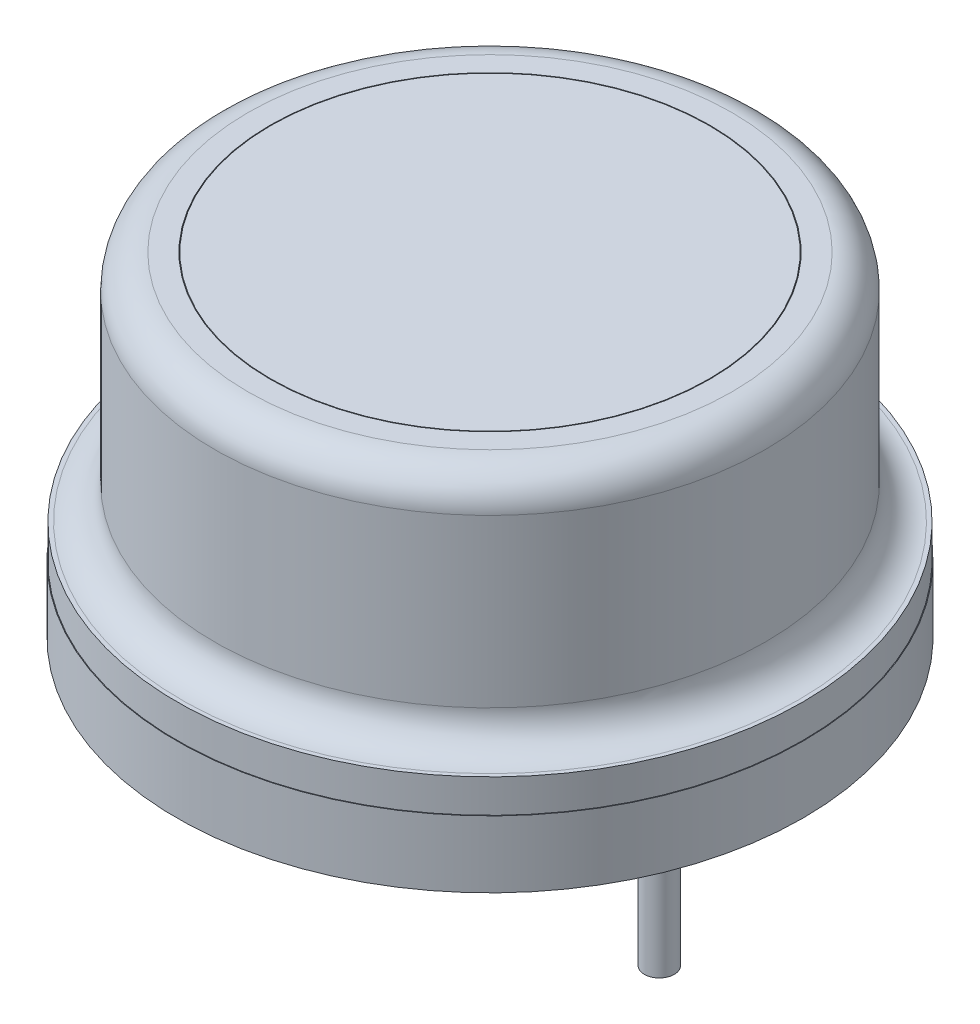
ISO-10303-21;
HEADER;
FILE_DESCRIPTION(('STEP AP214'),'2;1');
FILE_NAME('part.step','',(''),(''),'','','');
FILE_SCHEMA(('AUTOMOTIVE_DESIGN { 1 0 10303 214 1 1 1 1 }'));
ENDSEC;
DATA;
#1=APPLICATION_CONTEXT('core data for automotive mechanical design processes');
#2=APPLICATION_PROTOCOL_DEFINITION('international standard','automotive_design',2000,#1);
#3=PRODUCT_CONTEXT('',#1,'mechanical');
#4=PRODUCT('Part','Part','',(#3));
#5=PRODUCT_RELATED_PRODUCT_CATEGORY('part','',(#4));
#6=PRODUCT_DEFINITION_FORMATION('','',#4);
#7=PRODUCT_DEFINITION_CONTEXT('part definition',#1,'design');
#8=PRODUCT_DEFINITION('design','',#6,#7);
#9=PRODUCT_DEFINITION_SHAPE('','',#8);
#10=(LENGTH_UNIT() NAMED_UNIT(*) SI_UNIT(.MILLI.,.METRE.));
#11=(NAMED_UNIT(*) PLANE_ANGLE_UNIT() SI_UNIT($,.RADIAN.));
#12=(NAMED_UNIT(*) SI_UNIT($,.STERADIAN.) SOLID_ANGLE_UNIT());
#13=UNCERTAINTY_MEASURE_WITH_UNIT(LENGTH_MEASURE(1.E-05),#10,'distance_accuracy_value','');
#14=(GEOMETRIC_REPRESENTATION_CONTEXT(3) GLOBAL_UNCERTAINTY_ASSIGNED_CONTEXT((#13)) GLOBAL_UNIT_ASSIGNED_CONTEXT((#10,
#11,#12)) REPRESENTATION_CONTEXT('',''));
#15=CARTESIAN_POINT('',(0.,0.,0.));
#16=DIRECTION('',(0.,0.,1.));
#17=DIRECTION('',(1.,0.,0.));
#18=AXIS2_PLACEMENT_3D('',#15,#16,#17);
#19=CARTESIAN_POINT('',(0.,5.,0.));
#20=DIRECTION('',(0.,-1.,0.));
#21=DIRECTION('',(0.,0.,-1.));
#22=AXIS2_PLACEMENT_3D('',#19,#20,#21);
#23=PLANE('',#22);
#24=CARTESIAN_POINT('',(0.,5.,0.));
#25=DIRECTION('',(0.,-1.,0.));
#26=DIRECTION('',(0.,0.,-1.));
#27=AXIS2_PLACEMENT_3D('',#24,#25,#26);
#28=CIRCLE('',#27,3.29);
#29=CARTESIAN_POINT('',(0.,5.,-3.29));
#30=VERTEX_POINT('',#29);
#31=EDGE_CURVE('E11',#30,#30,#28,.T.);
#32=ORIENTED_EDGE('',*,*,#31,.F.);
#33=EDGE_LOOP('',(#32));
#34=FACE_BOUND('',#33,.T.);
#35=ADVANCED_FACE('F44',(#34),#23,.F.);
#36=CARTESIAN_POINT('',(0.,4.41,0.));
#37=DIRECTION('',(0.,-1.,0.));
#38=DIRECTION('',(0.,0.,-1.));
#39=AXIS2_PLACEMENT_3D('',#36,#37,#38);
#40=CYLINDRICAL_SURFACE('',#39,3.29);
#41=CARTESIAN_POINT('',(0.,4.41,0.));
#42=DIRECTION('',(0.,-1.,0.));
#43=DIRECTION('',(0.,0.,-1.));
#44=AXIS2_PLACEMENT_3D('',#41,#42,#43);
#45=CIRCLE('',#44,3.29);
#46=CARTESIAN_POINT('',(0.,4.41,-3.29));
#47=VERTEX_POINT('',#46);
#48=EDGE_CURVE('E50',#47,#47,#45,.T.);
#49=ORIENTED_EDGE('',*,*,#48,.F.);
#50=EDGE_LOOP('',(#49));
#51=FACE_BOUND('',#50,.T.);
#52=ORIENTED_EDGE('',*,*,#31,.T.);
#53=EDGE_LOOP('',(#52));
#54=FACE_BOUND('',#53,.T.);
#55=ADVANCED_FACE('F58',(#51,#54),#40,.T.);
#56=CARTESIAN_POINT('',(-3.29,4.41,0.));
#57=DIRECTION('',(0.,1.,0.));
#58=DIRECTION('',(0.,0.,1.));
#59=AXIS2_PLACEMENT_3D('',#56,#57,#58);
#60=PLANE('',#59);
#61=ORIENTED_EDGE('',*,*,#48,.T.);
#62=EDGE_LOOP('',(#61));
#63=FACE_BOUND('',#62,.T.);
#64=ADVANCED_FACE('F56',(#63),#60,.F.);
#65=CLOSED_SHELL('',(#35,#55,#64));
#66=MANIFOLD_SOLID_BREP('B2',#65);
#67=CARTESIAN_POINT('',(2.54,-3.,0.));
#68=DIRECTION('',(0.,1.,0.));
#69=DIRECTION('',(-1.,0.,0.));
#70=AXIS2_PLACEMENT_3D('',#67,#68,#69);
#71=CYLINDRICAL_SURFACE('',#70,0.225);
#72=CARTESIAN_POINT('',(2.54,-3.,0.));
#73=DIRECTION('',(0.,-1.,0.));
#74=DIRECTION('',(1.,0.,0.));
#75=AXIS2_PLACEMENT_3D('',#72,#73,#74);
#76=CIRCLE('',#75,0.225);
#77=CARTESIAN_POINT('',(2.765,-3.,0.));
#78=VERTEX_POINT('',#77);
#79=EDGE_CURVE('E43',#78,#78,#76,.T.);
#80=ORIENTED_EDGE('',*,*,#79,.F.);
#81=EDGE_LOOP('',(#80));
#82=FACE_BOUND('',#81,.T.);
#83=CARTESIAN_POINT('',(2.54,0.,0.));
#84=DIRECTION('',(0.,-1.,0.));
#85=DIRECTION('',(1.,0.,0.));
#86=AXIS2_PLACEMENT_3D('',#83,#84,#85);
#87=CIRCLE('',#86,0.225);
#88=CARTESIAN_POINT('',(2.765,0.,0.));
#89=VERTEX_POINT('',#88);
#90=EDGE_CURVE('E96',#89,#89,#87,.T.);
#91=ORIENTED_EDGE('',*,*,#90,.T.);
#92=EDGE_LOOP('',(#91));
#93=FACE_BOUND('',#92,.T.);
#94=ADVANCED_FACE('F93',(#82,#93),#71,.T.);
#95=CARTESIAN_POINT('',(2.54,-3.,0.));
#96=DIRECTION('',(0.,-1.,0.));
#97=DIRECTION('',(1.,0.,0.));
#98=AXIS2_PLACEMENT_3D('',#95,#96,#97);
#99=PLANE('',#98);
#100=ORIENTED_EDGE('',*,*,#79,.T.);
#101=EDGE_LOOP('',(#100));
#102=FACE_BOUND('',#101,.T.);
#103=ADVANCED_FACE('F108',(#102),#99,.T.);
#104=CARTESIAN_POINT('',(2.54,0.,0.));
#105=DIRECTION('',(0.,-1.,0.));
#106=DIRECTION('',(1.,0.,0.));
#107=AXIS2_PLACEMENT_3D('',#104,#105,#106);
#108=PLANE('',#107);
#109=ORIENTED_EDGE('',*,*,#90,.F.);
#110=EDGE_LOOP('',(#109));
#111=FACE_BOUND('',#110,.T.);
#112=ADVANCED_FACE('F106',(#111),#108,.F.);
#113=CLOSED_SHELL('',(#94,#103,#112));
#114=MANIFOLD_SOLID_BREP('B6',#113);
#115=CARTESIAN_POINT('',(-2.54,-3.,0.));
#116=DIRECTION('',(0.,1.,0.));
#117=DIRECTION('',(-1.,0.,0.));
#118=AXIS2_PLACEMENT_3D('',#115,#116,#117);
#119=CYLINDRICAL_SURFACE('',#118,0.225);
#120=CARTESIAN_POINT('',(-2.54,-3.,0.));
#121=DIRECTION('',(0.,-1.,0.));
#122=DIRECTION('',(1.,0.,0.));
#123=AXIS2_PLACEMENT_3D('',#120,#121,#122);
#124=CIRCLE('',#123,0.225);
#125=CARTESIAN_POINT('',(-2.315,-3.,0.));
#126=VERTEX_POINT('',#125);
#127=EDGE_CURVE('E92',#126,#126,#124,.T.);
#128=ORIENTED_EDGE('',*,*,#127,.F.);
#129=EDGE_LOOP('',(#128));
#130=FACE_BOUND('',#129,.T.);
#131=CARTESIAN_POINT('',(-2.54,0.,0.));
#132=DIRECTION('',(0.,-1.,0.));
#133=DIRECTION('',(1.,0.,0.));
#134=AXIS2_PLACEMENT_3D('',#131,#132,#133);
#135=CIRCLE('',#134,0.225);
#136=CARTESIAN_POINT('',(-2.315,0.,0.));
#137=VERTEX_POINT('',#136);
#138=EDGE_CURVE('E144',#137,#137,#135,.T.);
#139=ORIENTED_EDGE('',*,*,#138,.T.);
#140=EDGE_LOOP('',(#139));
#141=FACE_BOUND('',#140,.T.);
#142=ADVANCED_FACE('F141',(#130,#141),#119,.T.);
#143=CARTESIAN_POINT('',(-2.54,-3.,0.));
#144=DIRECTION('',(0.,-1.,0.));
#145=DIRECTION('',(1.,0.,0.));
#146=AXIS2_PLACEMENT_3D('',#143,#144,#145);
#147=PLANE('',#146);
#148=ORIENTED_EDGE('',*,*,#127,.T.);
#149=EDGE_LOOP('',(#148));
#150=FACE_BOUND('',#149,.T.);
#151=ADVANCED_FACE('F156',(#150),#147,.T.);
#152=CARTESIAN_POINT('',(-2.54,0.,0.));
#153=DIRECTION('',(0.,-1.,0.));
#154=DIRECTION('',(1.,0.,0.));
#155=AXIS2_PLACEMENT_3D('',#152,#153,#154);
#156=PLANE('',#155);
#157=ORIENTED_EDGE('',*,*,#138,.F.);
#158=EDGE_LOOP('',(#157));
#159=FACE_BOUND('',#158,.T.);
#160=ADVANCED_FACE('F154',(#159),#156,.F.);
#161=CLOSED_SHELL('',(#142,#151,#160));
#162=MANIFOLD_SOLID_BREP('B38',#161);
#163=CARTESIAN_POINT('',(0.,4.4,0.));
#164=DIRECTION('',(0.,-1.,0.));
#165=DIRECTION('',(1.,0.,0.));
#166=AXIS2_PLACEMENT_3D('',#163,#164,#165);
#167=PLANE('',#166);
#168=CARTESIAN_POINT('',(0.,4.4,0.));
#169=DIRECTION('',(0.,-1.,0.));
#170=DIRECTION('',(1.,0.,0.));
#171=AXIS2_PLACEMENT_3D('',#168,#169,#170);
#172=CIRCLE('',#171,3.3);
#173=CARTESIAN_POINT('',(3.3,4.4,0.));
#174=VERTEX_POINT('',#173);
#175=EDGE_CURVE('E140',#174,#174,#172,.T.);
#176=ORIENTED_EDGE('',*,*,#175,.F.);
#177=EDGE_LOOP('',(#176));
#178=FACE_BOUND('',#177,.T.);
#179=ADVANCED_FACE('F182',(#178),#167,.F.);
#180=CARTESIAN_POINT('',(0.,0.,0.));
#181=DIRECTION('',(0.,-1.,0.));
#182=DIRECTION('',(1.,0.,0.));
#183=AXIS2_PLACEMENT_3D('',#180,#181,#182);
#184=CYLINDRICAL_SURFACE('',#183,3.3);
#185=CARTESIAN_POINT('',(0.,5.,0.));
#186=DIRECTION('',(0.,-1.,0.));
#187=DIRECTION('',(1.,0.,0.));
#188=AXIS2_PLACEMENT_3D('',#185,#186,#187);
#189=CIRCLE('',#188,3.3);
#190=CARTESIAN_POINT('',(3.3,5.,0.));
#191=VERTEX_POINT('',#190);
#192=EDGE_CURVE('E188',#191,#191,#189,.T.);
#193=ORIENTED_EDGE('',*,*,#192,.F.);
#194=EDGE_LOOP('',(#193));
#195=FACE_BOUND('',#194,.T.);
#196=ORIENTED_EDGE('',*,*,#175,.T.);
#197=EDGE_LOOP('',(#196));
#198=FACE_BOUND('',#197,.T.);
#199=ADVANCED_FACE('F266',(#195,#198),#184,.F.);
#200=CARTESIAN_POINT('',(-3.3,5.,0.));
#201=DIRECTION('',(0.,-1.,0.));
#202=DIRECTION('',(1.,0.,0.));
#203=AXIS2_PLACEMENT_3D('',#200,#201,#202);
#204=PLANE('',#203);
#205=CARTESIAN_POINT('',(0.,5.,0.));
#206=DIRECTION('',(0.,-1.,0.));
#207=DIRECTION('',(1.,0.,0.));
#208=AXIS2_PLACEMENT_3D('',#205,#206,#207);
#209=CIRCLE('',#208,3.63);
#210=CARTESIAN_POINT('',(3.63,5.,0.));
#211=VERTEX_POINT('',#210);
#212=EDGE_CURVE('E192',#211,#211,#209,.T.);
#213=ORIENTED_EDGE('',*,*,#212,.F.);
#214=EDGE_LOOP('',(#213));
#215=FACE_BOUND('',#214,.T.);
#216=ORIENTED_EDGE('',*,*,#192,.T.);
#217=EDGE_LOOP('',(#216));
#218=FACE_BOUND('',#217,.T.);
#219=ADVANCED_FACE('F261',(#215,#218),#204,.F.);
#220=CARTESIAN_POINT('',(0.,4.5,0.));
#221=DIRECTION('',(0.,-1.,0.));
#222=DIRECTION('',(1.,0.,0.));
#223=AXIS2_PLACEMENT_3D('',#220,#221,#222);
#224=TOROIDAL_SURFACE('',#223,3.63,0.5);
#225=CARTESIAN_POINT('',(0.,4.5,0.));
#226=DIRECTION('',(0.,-1.,0.));
#227=DIRECTION('',(1.,0.,0.));
#228=AXIS2_PLACEMENT_3D('',#225,#226,#227);
#229=CIRCLE('',#228,4.13);
#230=CARTESIAN_POINT('',(4.13,4.5,0.));
#231=VERTEX_POINT('',#230);
#232=EDGE_CURVE('E196',#231,#231,#229,.T.);
#233=ORIENTED_EDGE('',*,*,#232,.F.);
#234=EDGE_LOOP('',(#233));
#235=FACE_BOUND('',#234,.T.);
#236=ORIENTED_EDGE('',*,*,#212,.T.);
#237=EDGE_LOOP('',(#236));
#238=FACE_BOUND('',#237,.T.);
#239=ADVANCED_FACE('F255',(#235,#238),#224,.T.);
#240=CARTESIAN_POINT('',(0.,0.,0.));
#241=DIRECTION('',(0.,-1.,0.));
#242=DIRECTION('',(1.,0.,0.));
#243=AXIS2_PLACEMENT_3D('',#240,#241,#242);
#244=CYLINDRICAL_SURFACE('',#243,4.13);
#245=CARTESIAN_POINT('',(0.,2.,0.));
#246=DIRECTION('',(0.,-1.,0.));
#247=DIRECTION('',(1.,0.,0.));
#248=AXIS2_PLACEMENT_3D('',#245,#246,#247);
#249=CIRCLE('',#248,4.13);
#250=CARTESIAN_POINT('',(4.13,2.,0.));
#251=VERTEX_POINT('',#250);
#252=EDGE_CURVE('E201',#251,#251,#249,.T.);
#253=ORIENTED_EDGE('',*,*,#252,.F.);
#254=EDGE_LOOP('',(#253));
#255=FACE_BOUND('',#254,.T.);
#256=ORIENTED_EDGE('',*,*,#232,.T.);
#257=EDGE_LOOP('',(#256));
#258=FACE_BOUND('',#257,.T.);
#259=ADVANCED_FACE('F249',(#255,#258),#244,.T.);
#260=CARTESIAN_POINT('',(0.,2.,0.));
#261=DIRECTION('',(0.,-1.,0.));
#262=DIRECTION('',(1.,0.,0.));
#263=AXIS2_PLACEMENT_3D('',#260,#261,#262);
#264=TOROIDAL_SURFACE('',#263,4.63,0.5);
#265=CARTESIAN_POINT('',(0.,1.5,0.));
#266=DIRECTION('',(0.,-1.,0.));
#267=DIRECTION('',(1.,0.,0.));
#268=AXIS2_PLACEMENT_3D('',#265,#266,#267);
#269=CIRCLE('',#268,4.63);
#270=CARTESIAN_POINT('',(4.63,1.5,0.));
#271=VERTEX_POINT('',#270);
#272=EDGE_CURVE('E204',#271,#271,#269,.T.);
#273=ORIENTED_EDGE('',*,*,#272,.F.);
#274=EDGE_LOOP('',(#273));
#275=FACE_BOUND('',#274,.T.);
#276=ORIENTED_EDGE('',*,*,#252,.T.);
#277=EDGE_LOOP('',(#276));
#278=FACE_BOUND('',#277,.T.);
#279=ADVANCED_FACE('F243',(#275,#278),#264,.F.);
#280=CARTESIAN_POINT('',(-4.63,1.5,0.));
#281=DIRECTION('',(0.,-1.,0.));
#282=DIRECTION('',(1.,0.,0.));
#283=AXIS2_PLACEMENT_3D('',#280,#281,#282);
#284=PLANE('',#283);
#285=CARTESIAN_POINT('',(0.,1.5,0.));
#286=DIRECTION('',(0.,-1.,0.));
#287=DIRECTION('',(1.,0.,0.));
#288=AXIS2_PLACEMENT_3D('',#285,#286,#287);
#289=CIRCLE('',#288,4.69);
#290=CARTESIAN_POINT('',(4.69,1.5,0.));
#291=VERTEX_POINT('',#290);
#292=EDGE_CURVE('E207',#291,#291,#289,.T.);
#293=ORIENTED_EDGE('',*,*,#292,.F.);
#294=EDGE_LOOP('',(#293));
#295=FACE_BOUND('',#294,.T.);
#296=ORIENTED_EDGE('',*,*,#272,.T.);
#297=EDGE_LOOP('',(#296));
#298=FACE_BOUND('',#297,.T.);
#299=ADVANCED_FACE('F237',(#295,#298),#284,.F.);
#300=CARTESIAN_POINT('',(0.,0.,0.));
#301=DIRECTION('',(0.,-1.,0.));
#302=DIRECTION('',(1.,0.,0.));
#303=AXIS2_PLACEMENT_3D('',#300,#301,#302);
#304=CYLINDRICAL_SURFACE('',#303,4.69);
#305=CARTESIAN_POINT('',(0.,1.,0.));
#306=DIRECTION('',(0.,-1.,0.));
#307=DIRECTION('',(1.,0.,0.));
#308=AXIS2_PLACEMENT_3D('',#305,#306,#307);
#309=CIRCLE('',#308,4.69);
#310=CARTESIAN_POINT('',(4.69,1.,0.));
#311=VERTEX_POINT('',#310);
#312=EDGE_CURVE('E210',#311,#311,#309,.T.);
#313=ORIENTED_EDGE('',*,*,#312,.F.);
#314=EDGE_LOOP('',(#313));
#315=FACE_BOUND('',#314,.T.);
#316=ORIENTED_EDGE('',*,*,#292,.T.);
#317=EDGE_LOOP('',(#316));
#318=FACE_BOUND('',#317,.T.);
#319=ADVANCED_FACE('F231',(#315,#318),#304,.T.);
#320=CARTESIAN_POINT('',(-4.69,1.,0.));
#321=DIRECTION('',(0.,-1.,0.));
#322=DIRECTION('',(1.,0.,0.));
#323=AXIS2_PLACEMENT_3D('',#320,#321,#322);
#324=PLANE('',#323);
#325=CARTESIAN_POINT('',(0.,1.,0.));
#326=DIRECTION('',(0.,-1.,0.));
#327=DIRECTION('',(1.,0.,0.));
#328=AXIS2_PLACEMENT_3D('',#325,#326,#327);
#329=CIRCLE('',#328,4.7);
#330=CARTESIAN_POINT('',(4.7,1.,0.));
#331=VERTEX_POINT('',#330);
#332=EDGE_CURVE('E213',#331,#331,#329,.T.);
#333=ORIENTED_EDGE('',*,*,#332,.F.);
#334=EDGE_LOOP('',(#333));
#335=FACE_BOUND('',#334,.T.);
#336=ORIENTED_EDGE('',*,*,#312,.T.);
#337=EDGE_LOOP('',(#336));
#338=FACE_BOUND('',#337,.T.);
#339=ADVANCED_FACE('F225',(#335,#338),#324,.F.);
#340=CARTESIAN_POINT('',(0.,0.,0.));
#341=DIRECTION('',(0.,-1.,0.));
#342=DIRECTION('',(1.,0.,0.));
#343=AXIS2_PLACEMENT_3D('',#340,#341,#342);
#344=CYLINDRICAL_SURFACE('',#343,4.7);
#345=CARTESIAN_POINT('',(0.,0.,0.));
#346=DIRECTION('',(0.,-1.,0.));
#347=DIRECTION('',(1.,0.,0.));
#348=AXIS2_PLACEMENT_3D('',#345,#346,#347);
#349=CIRCLE('',#348,4.7);
#350=CARTESIAN_POINT('',(4.7,0.,0.));
#351=VERTEX_POINT('',#350);
#352=EDGE_CURVE('E216',#351,#351,#349,.T.);
#353=ORIENTED_EDGE('',*,*,#352,.F.);
#354=EDGE_LOOP('',(#353));
#355=FACE_BOUND('',#354,.T.);
#356=ORIENTED_EDGE('',*,*,#332,.T.);
#357=EDGE_LOOP('',(#356));
#358=FACE_BOUND('',#357,.T.);
#359=ADVANCED_FACE('F222',(#355,#358),#344,.T.);
#360=CARTESIAN_POINT('',(-4.7,0.,0.));
#361=DIRECTION('',(0.,1.,0.));
#362=DIRECTION('',(-1.,0.,0.));
#363=AXIS2_PLACEMENT_3D('',#360,#361,#362);
#364=PLANE('',#363);
#365=ORIENTED_EDGE('',*,*,#352,.T.);
#366=EDGE_LOOP('',(#365));
#367=FACE_BOUND('',#366,.T.);
#368=ADVANCED_FACE('F220',(#367),#364,.F.);
#369=CLOSED_SHELL('',(#179,#199,#219,#239,#259,#279,#299,#319,#339,#359,#368));
#370=MANIFOLD_SOLID_BREP('B87',#369);
#371=ADVANCED_BREP_SHAPE_REPRESENTATION('',(#18,#66,#114,#162,#370),#14);
#372=SHAPE_DEFINITION_REPRESENTATION(#9,#371);
ENDSEC;
END-ISO-10303-21;
